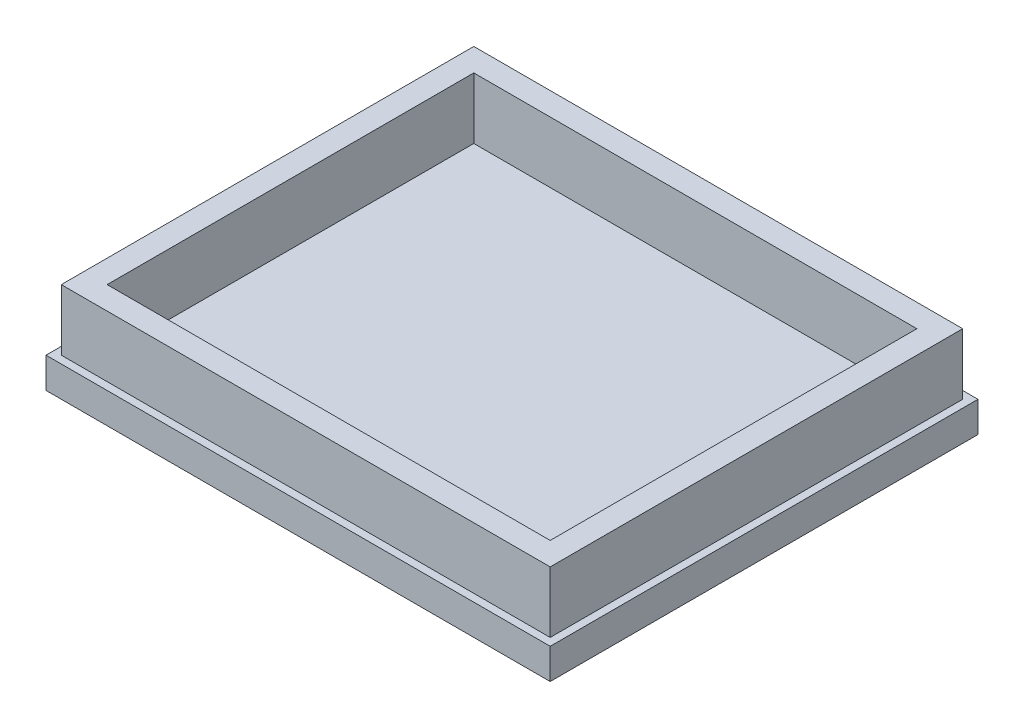
ISO-10303-21;
HEADER;
FILE_DESCRIPTION(('STEP AP214'),'2;1');
FILE_NAME('part.step','',(''),(''),'','','');
FILE_SCHEMA(('AUTOMOTIVE_DESIGN { 1 0 10303 214 1 1 1 1 }'));
ENDSEC;
DATA;
#1=APPLICATION_CONTEXT('core data for automotive mechanical design processes');
#2=APPLICATION_PROTOCOL_DEFINITION('international standard','automotive_design',2000,#1);
#3=PRODUCT_CONTEXT('',#1,'mechanical');
#4=PRODUCT('Part','Part','',(#3));
#5=PRODUCT_RELATED_PRODUCT_CATEGORY('part','',(#4));
#6=PRODUCT_DEFINITION_FORMATION('','',#4);
#7=PRODUCT_DEFINITION_CONTEXT('part definition',#1,'design');
#8=PRODUCT_DEFINITION('design','',#6,#7);
#9=PRODUCT_DEFINITION_SHAPE('','',#8);
#10=(LENGTH_UNIT() NAMED_UNIT(*) SI_UNIT(.MILLI.,.METRE.));
#11=(NAMED_UNIT(*) PLANE_ANGLE_UNIT() SI_UNIT($,.RADIAN.));
#12=(NAMED_UNIT(*) SI_UNIT($,.STERADIAN.) SOLID_ANGLE_UNIT());
#13=UNCERTAINTY_MEASURE_WITH_UNIT(LENGTH_MEASURE(1.E-05),#10,'distance_accuracy_value','');
#14=(GEOMETRIC_REPRESENTATION_CONTEXT(3) GLOBAL_UNCERTAINTY_ASSIGNED_CONTEXT((#13)) GLOBAL_UNIT_ASSIGNED_CONTEXT((#10,
#11,#12)) REPRESENTATION_CONTEXT('',''));
#15=CARTESIAN_POINT('',(0.,0.,0.));
#16=DIRECTION('',(0.,0.,1.));
#17=DIRECTION('',(1.,0.,0.));
#18=AXIS2_PLACEMENT_3D('',#15,#16,#17);
#19=CARTESIAN_POINT('',(0.,2.,0.));
#20=DIRECTION('',(0.,1.,0.));
#21=DIRECTION('',(0.,0.,1.));
#22=AXIS2_PLACEMENT_3D('',#19,#20,#21);
#23=PLANE('',#22);
#24=DIRECTION('',(0.,0.,1.));
#25=VECTOR('',#24,1.);
#26=CARTESIAN_POINT('',(0.,2.,0.));
#27=LINE('',#26,#25);
#28=CARTESIAN_POINT('',(0.,2.,0.));
#29=VERTEX_POINT('',#28);
#30=CARTESIAN_POINT('',(0.,2.,28.));
#31=VERTEX_POINT('',#30);
#32=EDGE_CURVE('E192',#29,#31,#27,.T.);
#33=ORIENTED_EDGE('',*,*,#32,.T.);
#34=DIRECTION('',(1.,0.,0.));
#35=VECTOR('',#34,1.);
#36=CARTESIAN_POINT('',(0.,2.,28.));
#37=LINE('',#36,#35);
#38=CARTESIAN_POINT('',(33.,2.,28.));
#39=VERTEX_POINT('',#38);
#40=EDGE_CURVE('E195',#31,#39,#37,.T.);
#41=ORIENTED_EDGE('',*,*,#40,.T.);
#42=DIRECTION('',(0.,0.,-1.));
#43=VECTOR('',#42,1.);
#44=CARTESIAN_POINT('',(33.,2.,0.));
#45=LINE('',#44,#43);
#46=CARTESIAN_POINT('',(33.,2.,0.));
#47=VERTEX_POINT('',#46);
#48=EDGE_CURVE('E198',#39,#47,#45,.T.);
#49=ORIENTED_EDGE('',*,*,#48,.T.);
#50=DIRECTION('',(-1.,0.,0.));
#51=VECTOR('',#50,1.);
#52=CARTESIAN_POINT('',(0.,2.,0.));
#53=LINE('',#52,#51);
#54=EDGE_CURVE('E200',#47,#29,#53,.T.);
#55=ORIENTED_EDGE('',*,*,#54,.T.);
#56=EDGE_LOOP('',(#33,#41,#49,#55));
#57=FACE_BOUND('',#56,.T.);
#58=DIRECTION('',(0.,0.,-1.));
#59=VECTOR('',#58,1.);
#60=CARTESIAN_POINT('',(32.5,2.,27.5));
#61=LINE('',#60,#59);
#62=CARTESIAN_POINT('',(32.5,2.,27.5));
#63=VERTEX_POINT('',#62);
#64=CARTESIAN_POINT('',(32.5,2.,0.5));
#65=VERTEX_POINT('',#64);
#66=EDGE_CURVE('E178',#63,#65,#61,.T.);
#67=ORIENTED_EDGE('',*,*,#66,.F.);
#68=DIRECTION('',(1.,0.,0.));
#69=VECTOR('',#68,1.);
#70=CARTESIAN_POINT('',(0.5,2.,27.5));
#71=LINE('',#70,#69);
#72=CARTESIAN_POINT('',(0.5,2.,27.5));
#73=VERTEX_POINT('',#72);
#74=EDGE_CURVE('E143',#73,#63,#71,.T.);
#75=ORIENTED_EDGE('',*,*,#74,.F.);
#76=DIRECTION('',(0.,0.,1.));
#77=VECTOR('',#76,1.);
#78=CARTESIAN_POINT('',(0.5,2.,27.5));
#79=LINE('',#78,#77);
#80=CARTESIAN_POINT('',(0.5,2.,0.500000000000002));
#81=VERTEX_POINT('',#80);
#82=EDGE_CURVE('E169',#81,#73,#79,.T.);
#83=ORIENTED_EDGE('',*,*,#82,.F.);
#84=DIRECTION('',(-1.,0.,0.));
#85=VECTOR('',#84,1.);
#86=CARTESIAN_POINT('',(0.5,2.,0.500000000000002));
#87=LINE('',#86,#85);
#88=EDGE_CURVE('E180',#65,#81,#87,.T.);
#89=ORIENTED_EDGE('',*,*,#88,.F.);
#90=EDGE_LOOP('',(#67,#75,#83,#89));
#91=FACE_BOUND('',#90,.T.);
#92=ADVANCED_FACE('F35',(#57,#91),#23,.T.);
#93=CARTESIAN_POINT('',(0.,2.,0.));
#94=DIRECTION('',(1.,0.,0.));
#95=DIRECTION('',(0.,0.,-1.));
#96=AXIS2_PLACEMENT_3D('',#93,#94,#95);
#97=PLANE('',#96);
#98=DIRECTION('',(0.,0.,1.));
#99=VECTOR('',#98,1.);
#100=CARTESIAN_POINT('',(0.,0.,0.));
#101=LINE('',#100,#99);
#102=CARTESIAN_POINT('',(0.,0.,0.));
#103=VERTEX_POINT('',#102);
#104=CARTESIAN_POINT('',(0.,0.,28.));
#105=VERTEX_POINT('',#104);
#106=EDGE_CURVE('E191',#103,#105,#101,.T.);
#107=ORIENTED_EDGE('',*,*,#106,.T.);
#108=DIRECTION('',(0.,-1.,0.));
#109=VECTOR('',#108,1.);
#110=CARTESIAN_POINT('',(0.,2.,28.));
#111=LINE('',#110,#109);
#112=EDGE_CURVE('E11',#31,#105,#111,.T.);
#113=ORIENTED_EDGE('',*,*,#112,.F.);
#114=ORIENTED_EDGE('',*,*,#32,.F.);
#115=DIRECTION('',(0.,-1.,0.));
#116=VECTOR('',#115,1.);
#117=CARTESIAN_POINT('',(0.,2.,0.));
#118=LINE('',#117,#116);
#119=EDGE_CURVE('E202',#29,#103,#118,.T.);
#120=ORIENTED_EDGE('',*,*,#119,.T.);
#121=EDGE_LOOP('',(#107,#113,#114,#120));
#122=FACE_BOUND('',#121,.T.);
#123=ADVANCED_FACE('F37',(#122),#97,.F.);
#124=CARTESIAN_POINT('',(0.,2.,28.));
#125=DIRECTION('',(0.,0.,-1.));
#126=DIRECTION('',(-1.,0.,0.));
#127=AXIS2_PLACEMENT_3D('',#124,#125,#126);
#128=PLANE('',#127);
#129=DIRECTION('',(1.,0.,0.));
#130=VECTOR('',#129,1.);
#131=CARTESIAN_POINT('',(0.,0.,28.));
#132=LINE('',#131,#130);
#133=CARTESIAN_POINT('',(33.,0.,28.));
#134=VERTEX_POINT('',#133);
#135=EDGE_CURVE('E205',#105,#134,#132,.T.);
#136=ORIENTED_EDGE('',*,*,#135,.T.);
#137=DIRECTION('',(0.,-1.,0.));
#138=VECTOR('',#137,1.);
#139=CARTESIAN_POINT('',(33.,2.,28.));
#140=LINE('',#139,#138);
#141=EDGE_CURVE('E43',#39,#134,#140,.T.);
#142=ORIENTED_EDGE('',*,*,#141,.F.);
#143=ORIENTED_EDGE('',*,*,#40,.F.);
#144=ORIENTED_EDGE('',*,*,#112,.T.);
#145=EDGE_LOOP('',(#136,#142,#143,#144));
#146=FACE_BOUND('',#145,.T.);
#147=ADVANCED_FACE('F235',(#146),#128,.F.);
#148=CARTESIAN_POINT('',(33.,2.,0.));
#149=DIRECTION('',(-1.,0.,0.));
#150=DIRECTION('',(0.,0.,1.));
#151=AXIS2_PLACEMENT_3D('',#148,#149,#150);
#152=PLANE('',#151);
#153=DIRECTION('',(0.,0.,-1.));
#154=VECTOR('',#153,1.);
#155=CARTESIAN_POINT('',(33.,0.,0.));
#156=LINE('',#155,#154);
#157=CARTESIAN_POINT('',(33.,0.,0.));
#158=VERTEX_POINT('',#157);
#159=EDGE_CURVE('E207',#134,#158,#156,.T.);
#160=ORIENTED_EDGE('',*,*,#159,.T.);
#161=DIRECTION('',(0.,-1.,0.));
#162=VECTOR('',#161,1.);
#163=CARTESIAN_POINT('',(33.,2.,0.));
#164=LINE('',#163,#162);
#165=EDGE_CURVE('E212',#47,#158,#164,.T.);
#166=ORIENTED_EDGE('',*,*,#165,.F.);
#167=ORIENTED_EDGE('',*,*,#48,.F.);
#168=ORIENTED_EDGE('',*,*,#141,.T.);
#169=EDGE_LOOP('',(#160,#166,#167,#168));
#170=FACE_BOUND('',#169,.T.);
#171=ADVANCED_FACE('F219',(#170),#152,.F.);
#172=CARTESIAN_POINT('',(0.,2.,0.));
#173=DIRECTION('',(0.,0.,1.));
#174=DIRECTION('',(1.,0.,0.));
#175=AXIS2_PLACEMENT_3D('',#172,#173,#174);
#176=PLANE('',#175);
#177=DIRECTION('',(-1.,0.,0.));
#178=VECTOR('',#177,1.);
#179=CARTESIAN_POINT('',(0.,0.,0.));
#180=LINE('',#179,#178);
#181=EDGE_CURVE('E196',#158,#103,#180,.T.);
#182=ORIENTED_EDGE('',*,*,#181,.T.);
#183=ORIENTED_EDGE('',*,*,#119,.F.);
#184=ORIENTED_EDGE('',*,*,#54,.F.);
#185=ORIENTED_EDGE('',*,*,#165,.T.);
#186=EDGE_LOOP('',(#182,#183,#184,#185));
#187=FACE_BOUND('',#186,.T.);
#188=ADVANCED_FACE('F228',(#187),#176,.F.);
#189=CARTESIAN_POINT('',(0.,0.,0.));
#190=DIRECTION('',(0.,1.,0.));
#191=DIRECTION('',(0.,0.,1.));
#192=AXIS2_PLACEMENT_3D('',#189,#190,#191);
#193=PLANE('',#192);
#194=ORIENTED_EDGE('',*,*,#106,.F.);
#195=ORIENTED_EDGE('',*,*,#181,.F.);
#196=ORIENTED_EDGE('',*,*,#159,.F.);
#197=ORIENTED_EDGE('',*,*,#135,.F.);
#198=EDGE_LOOP('',(#194,#195,#196,#197));
#199=FACE_BOUND('',#198,.T.);
#200=ADVANCED_FACE('F225',(#199),#193,.F.);
#201=CARTESIAN_POINT('',(0.,6.,0.));
#202=DIRECTION('',(0.,1.,0.));
#203=DIRECTION('',(0.,0.,1.));
#204=AXIS2_PLACEMENT_3D('',#201,#202,#203);
#205=PLANE('',#204);
#206=DIRECTION('',(1.,0.,0.));
#207=VECTOR('',#206,1.);
#208=CARTESIAN_POINT('',(0.5,6.,27.5));
#209=LINE('',#208,#207);
#210=CARTESIAN_POINT('',(0.5,6.,27.5));
#211=VERTEX_POINT('',#210);
#212=CARTESIAN_POINT('',(32.5,6.,27.5));
#213=VERTEX_POINT('',#212);
#214=EDGE_CURVE('E165',#211,#213,#209,.T.);
#215=ORIENTED_EDGE('',*,*,#214,.T.);
#216=DIRECTION('',(0.,0.,-1.));
#217=VECTOR('',#216,1.);
#218=CARTESIAN_POINT('',(32.5,6.,27.5));
#219=LINE('',#218,#217);
#220=CARTESIAN_POINT('',(32.5,6.,0.5));
#221=VERTEX_POINT('',#220);
#222=EDGE_CURVE('E168',#213,#221,#219,.T.);
#223=ORIENTED_EDGE('',*,*,#222,.T.);
#224=DIRECTION('',(-1.,0.,0.));
#225=VECTOR('',#224,1.);
#226=CARTESIAN_POINT('',(0.5,6.,0.500000000000002));
#227=LINE('',#226,#225);
#228=CARTESIAN_POINT('',(0.5,6.,0.500000000000002));
#229=VERTEX_POINT('',#228);
#230=EDGE_CURVE('E171',#221,#229,#227,.T.);
#231=ORIENTED_EDGE('',*,*,#230,.T.);
#232=DIRECTION('',(0.,0.,1.));
#233=VECTOR('',#232,1.);
#234=CARTESIAN_POINT('',(0.5,6.,27.5));
#235=LINE('',#234,#233);
#236=EDGE_CURVE('E173',#229,#211,#235,.T.);
#237=ORIENTED_EDGE('',*,*,#236,.T.);
#238=EDGE_LOOP('',(#215,#223,#231,#237));
#239=FACE_BOUND('',#238,.T.);
#240=DIRECTION('',(1.,0.,0.));
#241=VECTOR('',#240,1.);
#242=CARTESIAN_POINT('',(2.,6.,26.));
#243=LINE('',#242,#241);
#244=CARTESIAN_POINT('',(2.,6.,26.));
#245=VERTEX_POINT('',#244);
#246=CARTESIAN_POINT('',(31.,6.,26.));
#247=VERTEX_POINT('',#246);
#248=EDGE_CURVE('E135',#245,#247,#243,.T.);
#249=ORIENTED_EDGE('',*,*,#248,.F.);
#250=DIRECTION('',(0.,0.,1.));
#251=VECTOR('',#250,1.);
#252=CARTESIAN_POINT('',(2.,6.,26.));
#253=LINE('',#252,#251);
#254=CARTESIAN_POINT('',(2.,6.,2.));
#255=VERTEX_POINT('',#254);
#256=EDGE_CURVE('E126',#255,#245,#253,.T.);
#257=ORIENTED_EDGE('',*,*,#256,.F.);
#258=DIRECTION('',(-1.,0.,0.));
#259=VECTOR('',#258,1.);
#260=CARTESIAN_POINT('',(2.,6.,2.));
#261=LINE('',#260,#259);
#262=CARTESIAN_POINT('',(31.,6.,2.));
#263=VERTEX_POINT('',#262);
#264=EDGE_CURVE('E151',#263,#255,#261,.T.);
#265=ORIENTED_EDGE('',*,*,#264,.F.);
#266=DIRECTION('',(0.,0.,-1.));
#267=VECTOR('',#266,1.);
#268=CARTESIAN_POINT('',(31.,6.,26.));
#269=LINE('',#268,#267);
#270=EDGE_CURVE('E149',#247,#263,#269,.T.);
#271=ORIENTED_EDGE('',*,*,#270,.F.);
#272=EDGE_LOOP('',(#249,#257,#265,#271));
#273=FACE_BOUND('',#272,.T.);
#274=ADVANCED_FACE('F147',(#239,#273),#205,.T.);
#275=CARTESIAN_POINT('',(0.5,6.,27.5));
#276=DIRECTION('',(0.,0.,-1.));
#277=DIRECTION('',(-1.,0.,0.));
#278=AXIS2_PLACEMENT_3D('',#275,#276,#277);
#279=PLANE('',#278);
#280=ORIENTED_EDGE('',*,*,#74,.T.);
#281=DIRECTION('',(0.,-1.,0.));
#282=VECTOR('',#281,1.);
#283=CARTESIAN_POINT('',(32.5,6.,27.5));
#284=LINE('',#283,#282);
#285=EDGE_CURVE('E189',#213,#63,#284,.T.);
#286=ORIENTED_EDGE('',*,*,#285,.F.);
#287=ORIENTED_EDGE('',*,*,#214,.F.);
#288=DIRECTION('',(0.,-1.,0.));
#289=VECTOR('',#288,1.);
#290=CARTESIAN_POINT('',(0.5,6.,27.5));
#291=LINE('',#290,#289);
#292=EDGE_CURVE('E175',#211,#73,#291,.T.);
#293=ORIENTED_EDGE('',*,*,#292,.T.);
#294=EDGE_LOOP('',(#280,#286,#287,#293));
#295=FACE_BOUND('',#294,.T.);
#296=ADVANCED_FACE('F271',(#295),#279,.F.);
#297=CARTESIAN_POINT('',(32.5,6.,27.5));
#298=DIRECTION('',(-1.,0.,0.));
#299=DIRECTION('',(0.,0.,1.));
#300=AXIS2_PLACEMENT_3D('',#297,#298,#299);
#301=PLANE('',#300);
#302=ORIENTED_EDGE('',*,*,#66,.T.);
#303=DIRECTION('',(0.,-1.,0.));
#304=VECTOR('',#303,1.);
#305=CARTESIAN_POINT('',(32.5,6.,0.5));
#306=LINE('',#305,#304);
#307=EDGE_CURVE('E186',#221,#65,#306,.T.);
#308=ORIENTED_EDGE('',*,*,#307,.F.);
#309=ORIENTED_EDGE('',*,*,#222,.F.);
#310=ORIENTED_EDGE('',*,*,#285,.T.);
#311=EDGE_LOOP('',(#302,#308,#309,#310));
#312=FACE_BOUND('',#311,.T.);
#313=ADVANCED_FACE('F278',(#312),#301,.F.);
#314=CARTESIAN_POINT('',(0.5,6.,0.500000000000002));
#315=DIRECTION('',(0.,0.,1.));
#316=DIRECTION('',(1.,0.,0.));
#317=AXIS2_PLACEMENT_3D('',#314,#315,#316);
#318=PLANE('',#317);
#319=ORIENTED_EDGE('',*,*,#88,.T.);
#320=DIRECTION('',(0.,-1.,0.));
#321=VECTOR('',#320,1.);
#322=CARTESIAN_POINT('',(0.5,6.,0.500000000000002));
#323=LINE('',#322,#321);
#324=EDGE_CURVE('E50',#229,#81,#323,.T.);
#325=ORIENTED_EDGE('',*,*,#324,.F.);
#326=ORIENTED_EDGE('',*,*,#230,.F.);
#327=ORIENTED_EDGE('',*,*,#307,.T.);
#328=EDGE_LOOP('',(#319,#325,#326,#327));
#329=FACE_BOUND('',#328,.T.);
#330=ADVANCED_FACE('F275',(#329),#318,.F.);
#331=CARTESIAN_POINT('',(0.5,6.,27.5));
#332=DIRECTION('',(1.,0.,0.));
#333=DIRECTION('',(0.,0.,-1.));
#334=AXIS2_PLACEMENT_3D('',#331,#332,#333);
#335=PLANE('',#334);
#336=ORIENTED_EDGE('',*,*,#82,.T.);
#337=ORIENTED_EDGE('',*,*,#292,.F.);
#338=ORIENTED_EDGE('',*,*,#236,.F.);
#339=ORIENTED_EDGE('',*,*,#324,.T.);
#340=EDGE_LOOP('',(#336,#337,#338,#339));
#341=FACE_BOUND('',#340,.T.);
#342=ADVANCED_FACE('F268',(#341),#335,.F.);
#343=CARTESIAN_POINT('',(2.,6.,26.));
#344=DIRECTION('',(1.,0.,0.));
#345=DIRECTION('',(0.,0.,-1.));
#346=AXIS2_PLACEMENT_3D('',#343,#344,#345);
#347=PLANE('',#346);
#348=DIRECTION('',(0.,0.,1.));
#349=VECTOR('',#348,1.);
#350=CARTESIAN_POINT('',(2.,2.,26.));
#351=LINE('',#350,#349);
#352=CARTESIAN_POINT('',(2.,2.,2.));
#353=VERTEX_POINT('',#352);
#354=CARTESIAN_POINT('',(2.,2.,26.));
#355=VERTEX_POINT('',#354);
#356=EDGE_CURVE('E58',#353,#355,#351,.T.);
#357=ORIENTED_EDGE('',*,*,#356,.F.);
#358=DIRECTION('',(0.,-1.,0.));
#359=VECTOR('',#358,1.);
#360=CARTESIAN_POINT('',(2.,6.,2.));
#361=LINE('',#360,#359);
#362=EDGE_CURVE('E131',#255,#353,#361,.T.);
#363=ORIENTED_EDGE('',*,*,#362,.F.);
#364=ORIENTED_EDGE('',*,*,#256,.T.);
#365=DIRECTION('',(0.,-1.,0.));
#366=VECTOR('',#365,1.);
#367=CARTESIAN_POINT('',(2.,6.,26.));
#368=LINE('',#367,#366);
#369=EDGE_CURVE('E129',#245,#355,#368,.T.);
#370=ORIENTED_EDGE('',*,*,#369,.T.);
#371=EDGE_LOOP('',(#357,#363,#364,#370));
#372=FACE_BOUND('',#371,.T.);
#373=ADVANCED_FACE('F128',(#372),#347,.T.);
#374=CARTESIAN_POINT('',(2.,6.,26.));
#375=DIRECTION('',(0.,0.,-1.));
#376=DIRECTION('',(-1.,0.,0.));
#377=AXIS2_PLACEMENT_3D('',#374,#375,#376);
#378=PLANE('',#377);
#379=DIRECTION('',(1.,0.,0.));
#380=VECTOR('',#379,1.);
#381=CARTESIAN_POINT('',(2.,2.,26.));
#382=LINE('',#381,#380);
#383=CARTESIAN_POINT('',(31.,2.,26.));
#384=VERTEX_POINT('',#383);
#385=EDGE_CURVE('E142',#355,#384,#382,.T.);
#386=ORIENTED_EDGE('',*,*,#385,.F.);
#387=ORIENTED_EDGE('',*,*,#369,.F.);
#388=ORIENTED_EDGE('',*,*,#248,.T.);
#389=DIRECTION('',(0.,-1.,0.));
#390=VECTOR('',#389,1.);
#391=CARTESIAN_POINT('',(31.,6.,26.));
#392=LINE('',#391,#390);
#393=EDGE_CURVE('E144',#247,#384,#392,.T.);
#394=ORIENTED_EDGE('',*,*,#393,.T.);
#395=EDGE_LOOP('',(#386,#387,#388,#394));
#396=FACE_BOUND('',#395,.T.);
#397=ADVANCED_FACE('F139',(#396),#378,.T.);
#398=CARTESIAN_POINT('',(31.,6.,26.));
#399=DIRECTION('',(-1.,0.,0.));
#400=DIRECTION('',(0.,0.,1.));
#401=AXIS2_PLACEMENT_3D('',#398,#399,#400);
#402=PLANE('',#401);
#403=DIRECTION('',(0.,0.,-1.));
#404=VECTOR('',#403,1.);
#405=CARTESIAN_POINT('',(31.,2.,26.));
#406=LINE('',#405,#404);
#407=CARTESIAN_POINT('',(31.,2.,2.));
#408=VERTEX_POINT('',#407);
#409=EDGE_CURVE('E157',#384,#408,#406,.T.);
#410=ORIENTED_EDGE('',*,*,#409,.F.);
#411=ORIENTED_EDGE('',*,*,#393,.F.);
#412=ORIENTED_EDGE('',*,*,#270,.T.);
#413=DIRECTION('',(0.,-1.,0.));
#414=VECTOR('',#413,1.);
#415=CARTESIAN_POINT('',(31.,6.,2.));
#416=LINE('',#415,#414);
#417=EDGE_CURVE('E161',#263,#408,#416,.T.);
#418=ORIENTED_EDGE('',*,*,#417,.T.);
#419=EDGE_LOOP('',(#410,#411,#412,#418));
#420=FACE_BOUND('',#419,.T.);
#421=ADVANCED_FACE('F254',(#420),#402,.T.);
#422=CARTESIAN_POINT('',(2.,6.,2.));
#423=DIRECTION('',(0.,0.,1.));
#424=DIRECTION('',(1.,0.,0.));
#425=AXIS2_PLACEMENT_3D('',#422,#423,#424);
#426=PLANE('',#425);
#427=DIRECTION('',(-1.,0.,0.));
#428=VECTOR('',#427,1.);
#429=CARTESIAN_POINT('',(2.,2.,2.));
#430=LINE('',#429,#428);
#431=EDGE_CURVE('E136',#408,#353,#430,.T.);
#432=ORIENTED_EDGE('',*,*,#431,.F.);
#433=ORIENTED_EDGE('',*,*,#417,.F.);
#434=ORIENTED_EDGE('',*,*,#264,.T.);
#435=ORIENTED_EDGE('',*,*,#362,.T.);
#436=EDGE_LOOP('',(#432,#433,#434,#435));
#437=FACE_BOUND('',#436,.T.);
#438=ADVANCED_FACE('F250',(#437),#426,.T.);
#439=ORIENTED_EDGE('',*,*,#356,.T.);
#440=ORIENTED_EDGE('',*,*,#385,.T.);
#441=ORIENTED_EDGE('',*,*,#409,.T.);
#442=ORIENTED_EDGE('',*,*,#431,.T.);
#443=EDGE_LOOP('',(#439,#440,#441,#442));
#444=FACE_BOUND('',#443,.T.);
#445=ADVANCED_FACE('F244',(#444),#23,.T.);
#446=CLOSED_SHELL('',(#92,#123,#147,#171,#188,#200,#274,#296,#313,#330,#342,#373,#397,#421,#438,#445));
#447=MANIFOLD_SOLID_BREP('B2',#446);
#448=ADVANCED_BREP_SHAPE_REPRESENTATION('',(#18,#447),#14);
#449=SHAPE_DEFINITION_REPRESENTATION(#9,#448);
ENDSEC;
END-ISO-10303-21;
